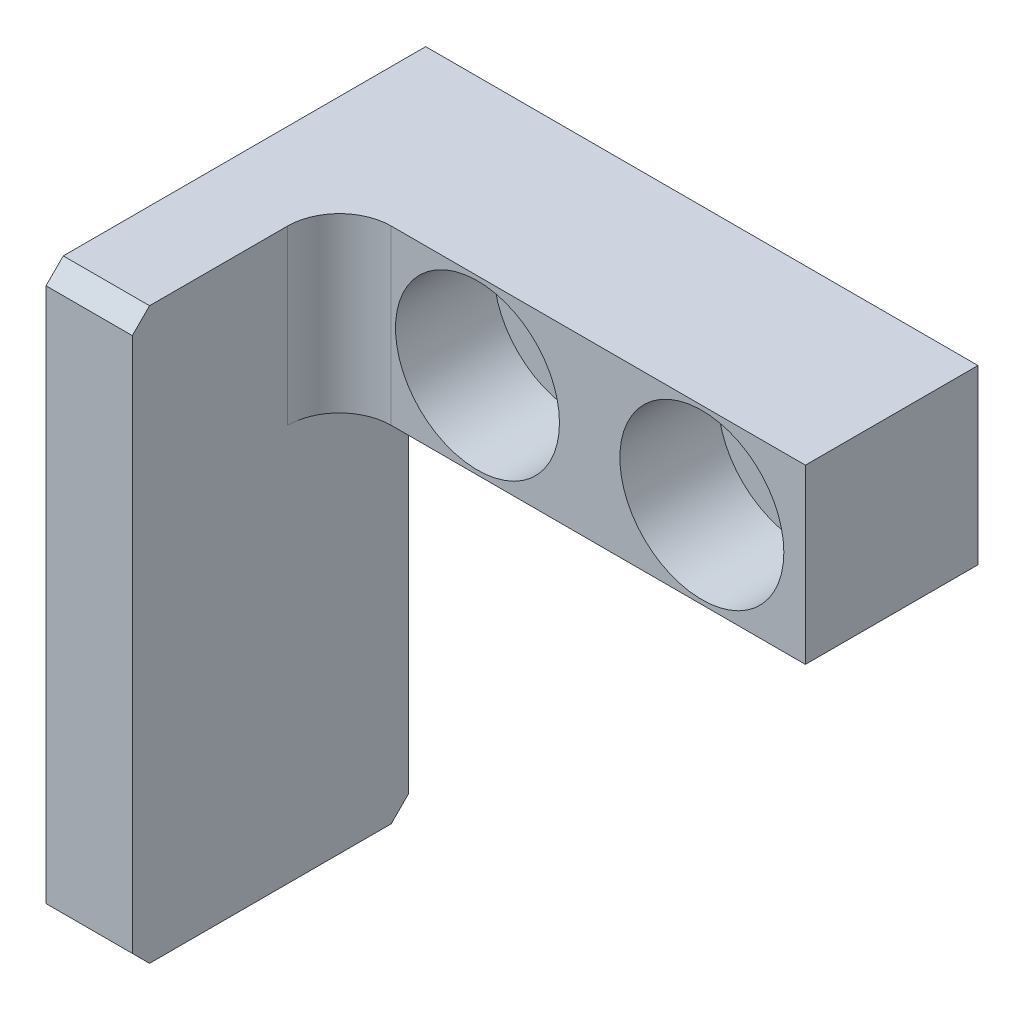
ISO-10303-21;
HEADER;
FILE_DESCRIPTION(('STEP AP214'),'2;1');
FILE_NAME('part.step','',(''),(''),'','','');
FILE_SCHEMA(('AUTOMOTIVE_DESIGN { 1 0 10303 214 1 1 1 1 }'));
ENDSEC;
DATA;
#1=APPLICATION_CONTEXT('core data for automotive mechanical design processes');
#2=APPLICATION_PROTOCOL_DEFINITION('international standard','automotive_design',2000,#1);
#3=PRODUCT_CONTEXT('',#1,'mechanical');
#4=PRODUCT('Part','Part','',(#3));
#5=PRODUCT_RELATED_PRODUCT_CATEGORY('part','',(#4));
#6=PRODUCT_DEFINITION_FORMATION('','',#4);
#7=PRODUCT_DEFINITION_CONTEXT('part definition',#1,'design');
#8=PRODUCT_DEFINITION('design','',#6,#7);
#9=PRODUCT_DEFINITION_SHAPE('','',#8);
#10=(LENGTH_UNIT() NAMED_UNIT(*) SI_UNIT(.MILLI.,.METRE.));
#11=(NAMED_UNIT(*) PLANE_ANGLE_UNIT() SI_UNIT($,.RADIAN.));
#12=(NAMED_UNIT(*) SI_UNIT($,.STERADIAN.) SOLID_ANGLE_UNIT());
#13=UNCERTAINTY_MEASURE_WITH_UNIT(LENGTH_MEASURE(1.E-05),#10,'distance_accuracy_value','');
#14=(GEOMETRIC_REPRESENTATION_CONTEXT(3) GLOBAL_UNCERTAINTY_ASSIGNED_CONTEXT((#13)) GLOBAL_UNIT_ASSIGNED_CONTEXT((#10,
#11,#12)) REPRESENTATION_CONTEXT('',''));
#15=CARTESIAN_POINT('',(0.,0.,0.));
#16=DIRECTION('',(0.,0.,1.));
#17=DIRECTION('',(1.,0.,0.));
#18=AXIS2_PLACEMENT_3D('',#15,#16,#17);
#19=CARTESIAN_POINT('',(16.,33.,11.));
#20=DIRECTION('',(-1.,0.,0.));
#21=DIRECTION('',(0.,0.,1.));
#22=AXIS2_PLACEMENT_3D('',#19,#20,#21);
#23=PLANE('',#22);
#24=DIRECTION('',(0.,0.,-1.));
#25=VECTOR('',#24,1.);
#26=CARTESIAN_POINT('',(16.,23.,-1.));
#27=LINE('',#26,#25);
#28=CARTESIAN_POINT('',(16.,23.,-1.));
#29=VERTEX_POINT('',#28);
#30=CARTESIAN_POINT('',(16.,23.,-11.));
#31=VERTEX_POINT('',#30);
#32=EDGE_CURVE('E137',#29,#31,#27,.T.);
#33=ORIENTED_EDGE('',*,*,#32,.T.);
#34=DIRECTION('',(0.,-1.,0.));
#35=VECTOR('',#34,1.);
#36=CARTESIAN_POINT('',(16.,33.,-11.));
#37=LINE('',#36,#35);
#38=CARTESIAN_POINT('',(16.,33.,-11.));
#39=VERTEX_POINT('',#38);
#40=EDGE_CURVE('E132',#39,#31,#37,.T.);
#41=ORIENTED_EDGE('',*,*,#40,.F.);
#42=DIRECTION('',(0.,0.,-1.));
#43=VECTOR('',#42,1.);
#44=CARTESIAN_POINT('',(16.,33.,11.));
#45=LINE('',#44,#43);
#46=CARTESIAN_POINT('',(16.,33.,-1.));
#47=VERTEX_POINT('',#46);
#48=EDGE_CURVE('E202',#47,#39,#45,.T.);
#49=ORIENTED_EDGE('',*,*,#48,.F.);
#50=DIRECTION('',(0.,1.,0.));
#51=VECTOR('',#50,1.);
#52=CARTESIAN_POINT('',(16.,0.,-1.));
#53=LINE('',#52,#51);
#54=EDGE_CURVE('E200',#29,#47,#53,.T.);
#55=ORIENTED_EDGE('',*,*,#54,.F.);
#56=EDGE_LOOP('',(#33,#41,#49,#55));
#57=FACE_BOUND('',#56,.T.);
#58=ADVANCED_FACE('F34',(#57),#23,.F.);
#59=CARTESIAN_POINT('',(-16.,33.,-11.));
#60=DIRECTION('',(0.,0.,1.));
#61=DIRECTION('',(1.,0.,0.));
#62=AXIS2_PLACEMENT_3D('',#59,#60,#61);
#63=PLANE('',#62);
#64=CARTESIAN_POINT('',(-3.,28.,-11.));
#65=DIRECTION('',(0.,0.,1.));
#66=DIRECTION('',(1.,0.,0.));
#67=AXIS2_PLACEMENT_3D('',#64,#65,#66);
#68=CIRCLE('',#67,2.75);
#69=CARTESIAN_POINT('',(-0.249999999999997,28.,-11.));
#70=VERTEX_POINT('',#69);
#71=EDGE_CURVE('E276',#70,#70,#68,.T.);
#72=ORIENTED_EDGE('',*,*,#71,.T.);
#73=EDGE_LOOP('',(#72));
#74=FACE_BOUND('',#73,.T.);
#75=CARTESIAN_POINT('',(10.,28.,-11.));
#76=DIRECTION('',(0.,0.,1.));
#77=DIRECTION('',(1.,0.,0.));
#78=AXIS2_PLACEMENT_3D('',#75,#76,#77);
#79=CIRCLE('',#78,2.75);
#80=CARTESIAN_POINT('',(12.75,28.,-11.));
#81=VERTEX_POINT('',#80);
#82=EDGE_CURVE('E261',#81,#81,#79,.T.);
#83=ORIENTED_EDGE('',*,*,#82,.T.);
#84=EDGE_LOOP('',(#83));
#85=FACE_BOUND('',#84,.T.);
#86=DIRECTION('',(1.,0.,0.));
#87=VECTOR('',#86,1.);
#88=CARTESIAN_POINT('',(-36.0798724079689,23.,-11.));
#89=LINE('',#88,#87);
#90=CARTESIAN_POINT('',(-16.,23.,-11.));
#91=VERTEX_POINT('',#90);
#92=EDGE_CURVE('E125',#91,#31,#89,.T.);
#93=ORIENTED_EDGE('',*,*,#92,.F.);
#94=DIRECTION('',(0.,-1.,0.));
#95=VECTOR('',#94,1.);
#96=CARTESIAN_POINT('',(-16.,33.,-11.));
#97=LINE('',#96,#95);
#98=CARTESIAN_POINT('',(-16.,33.,-11.));
#99=VERTEX_POINT('',#98);
#100=EDGE_CURVE('E130',#99,#91,#97,.T.);
#101=ORIENTED_EDGE('',*,*,#100,.F.);
#102=DIRECTION('',(-1.,0.,0.));
#103=VECTOR('',#102,1.);
#104=CARTESIAN_POINT('',(-16.,33.,-11.));
#105=LINE('',#104,#103);
#106=EDGE_CURVE('E210',#39,#99,#105,.T.);
#107=ORIENTED_EDGE('',*,*,#106,.F.);
#108=ORIENTED_EDGE('',*,*,#40,.T.);
#109=EDGE_LOOP('',(#93,#101,#107,#108));
#110=FACE_BOUND('',#109,.T.);
#111=ADVANCED_FACE('F127',(#74,#85,#110),#63,.F.);
#112=CARTESIAN_POINT('',(16.,0.,-1.));
#113=DIRECTION('',(0.,0.,-1.));
#114=DIRECTION('',(-1.,0.,0.));
#115=AXIS2_PLACEMENT_3D('',#112,#113,#114);
#116=PLANE('',#115);
#117=CARTESIAN_POINT('',(-3.,28.,-0.999999999999999));
#118=DIRECTION('',(0.,0.,1.));
#119=DIRECTION('',(1.,0.,0.));
#120=AXIS2_PLACEMENT_3D('',#117,#118,#119);
#121=CIRCLE('',#120,4.75);
#122=CARTESIAN_POINT('',(1.75,28.,-0.999999999999999));
#123=VERTEX_POINT('',#122);
#124=EDGE_CURVE('E285',#123,#123,#121,.T.);
#125=ORIENTED_EDGE('',*,*,#124,.F.);
#126=EDGE_LOOP('',(#125));
#127=FACE_BOUND('',#126,.T.);
#128=CARTESIAN_POINT('',(10.,28.,-0.999999999999999));
#129=DIRECTION('',(0.,0.,1.));
#130=DIRECTION('',(1.,0.,0.));
#131=AXIS2_PLACEMENT_3D('',#128,#129,#130);
#132=CIRCLE('',#131,4.75);
#133=CARTESIAN_POINT('',(14.75,28.,-0.999999999999999));
#134=VERTEX_POINT('',#133);
#135=EDGE_CURVE('E273',#134,#134,#132,.T.);
#136=ORIENTED_EDGE('',*,*,#135,.F.);
#137=EDGE_LOOP('',(#136));
#138=FACE_BOUND('',#137,.T.);
#139=DIRECTION('',(-1.,0.,0.));
#140=VECTOR('',#139,1.);
#141=CARTESIAN_POINT('',(16.,33.,-1.));
#142=LINE('',#141,#140);
#143=CARTESIAN_POINT('',(-8.,33.,-0.999999999999998));
#144=VERTEX_POINT('',#143);
#145=EDGE_CURVE('E251',#47,#144,#142,.T.);
#146=ORIENTED_EDGE('',*,*,#145,.T.);
#147=DIRECTION('',(0.,1.,0.));
#148=VECTOR('',#147,1.);
#149=CARTESIAN_POINT('',(-8.,23.,-0.999999999999998));
#150=LINE('',#149,#148);
#151=CARTESIAN_POINT('',(-8.,23.,-1.));
#152=VERTEX_POINT('',#151);
#153=EDGE_CURVE('E160',#144,#152,#150,.F.);
#154=ORIENTED_EDGE('',*,*,#153,.T.);
#155=DIRECTION('',(1.,0.,0.));
#156=VECTOR('',#155,1.);
#157=CARTESIAN_POINT('',(-36.0798724079689,23.,-1.));
#158=LINE('',#157,#156);
#159=EDGE_CURVE('E260',#152,#29,#158,.T.);
#160=ORIENTED_EDGE('',*,*,#159,.T.);
#161=ORIENTED_EDGE('',*,*,#54,.T.);
#162=EDGE_LOOP('',(#146,#154,#160,#161));
#163=FACE_BOUND('',#162,.T.);
#164=ADVANCED_FACE('F229',(#127,#138,#163),#116,.F.);
#165=CARTESIAN_POINT('',(-16.,33.,11.));
#166=DIRECTION('',(1.,0.,0.));
#167=DIRECTION('',(0.,0.,-1.));
#168=AXIS2_PLACEMENT_3D('',#165,#166,#167);
#169=PLANE('',#168);
#170=DIRECTION('',(0.,-1.,0.));
#171=VECTOR('',#170,1.);
#172=CARTESIAN_POINT('',(-16.,0.,-5.));
#173=LINE('',#172,#171);
#174=CARTESIAN_POINT('',(-16.,23.,-5.));
#175=VERTEX_POINT('',#174);
#176=CARTESIAN_POINT('',(-16.,1.,-5.));
#177=VERTEX_POINT('',#176);
#178=EDGE_CURVE('E146',#175,#177,#173,.T.);
#179=ORIENTED_EDGE('',*,*,#178,.T.);
#180=DIRECTION('',(0.,-0.70710678118655,0.707106781186545));
#181=VECTOR('',#180,1.);
#182=CARTESIAN_POINT('',(-16.,0.,-4.00000000000001));
#183=LINE('',#182,#181);
#184=CARTESIAN_POINT('',(-16.,0.,-4.));
#185=VERTEX_POINT('',#184);
#186=EDGE_CURVE('E182',#177,#185,#183,.T.);
#187=ORIENTED_EDGE('',*,*,#186,.T.);
#188=DIRECTION('',(0.,0.,1.));
#189=VECTOR('',#188,1.);
#190=CARTESIAN_POINT('',(-16.,0.,11.));
#191=LINE('',#190,#189);
#192=CARTESIAN_POINT('',(-16.,0.,9.99999999999999));
#193=VERTEX_POINT('',#192);
#194=EDGE_CURVE('E199',#185,#193,#191,.T.);
#195=ORIENTED_EDGE('',*,*,#194,.T.);
#196=DIRECTION('',(0.,0.707106781186545,0.70710678118655));
#197=VECTOR('',#196,1.);
#198=CARTESIAN_POINT('',(-16.,1.,11.));
#199=LINE('',#198,#197);
#200=CARTESIAN_POINT('',(-16.,1.00000000000001,11.));
#201=VERTEX_POINT('',#200);
#202=EDGE_CURVE('E55',#193,#201,#199,.T.);
#203=ORIENTED_EDGE('',*,*,#202,.T.);
#204=DIRECTION('',(0.,-1.,0.));
#205=VECTOR('',#204,1.);
#206=CARTESIAN_POINT('',(-16.,33.,11.));
#207=LINE('',#206,#205);
#208=CARTESIAN_POINT('',(-16.,32.,11.));
#209=VERTEX_POINT('',#208);
#210=EDGE_CURVE('E151',#209,#201,#207,.T.);
#211=ORIENTED_EDGE('',*,*,#210,.F.);
#212=DIRECTION('',(0.,-0.70710678118655,0.707106781186545));
#213=VECTOR('',#212,1.);
#214=CARTESIAN_POINT('',(-16.,33.,10.));
#215=LINE('',#214,#213);
#216=CARTESIAN_POINT('',(-16.,33.,10.));
#217=VERTEX_POINT('',#216);
#218=EDGE_CURVE('E49',#209,#217,#215,.F.);
#219=ORIENTED_EDGE('',*,*,#218,.T.);
#220=DIRECTION('',(0.,0.,1.));
#221=VECTOR('',#220,1.);
#222=CARTESIAN_POINT('',(-16.,33.,11.));
#223=LINE('',#222,#221);
#224=EDGE_CURVE('E150',#99,#217,#223,.T.);
#225=ORIENTED_EDGE('',*,*,#224,.F.);
#226=ORIENTED_EDGE('',*,*,#100,.T.);
#227=DIRECTION('',(0.,0.,1.));
#228=VECTOR('',#227,1.);
#229=CARTESIAN_POINT('',(-16.,23.,-11.));
#230=LINE('',#229,#228);
#231=EDGE_CURVE('E140',#91,#175,#230,.T.);
#232=ORIENTED_EDGE('',*,*,#231,.T.);
#233=EDGE_LOOP('',(#179,#187,#195,#203,#211,#219,#225,#226,#232));
#234=FACE_BOUND('',#233,.T.);
#235=ADVANCED_FACE('F149',(#234),#169,.F.);
#236=CARTESIAN_POINT('',(-16.,33.,11.));
#237=DIRECTION('',(0.,0.,-1.));
#238=DIRECTION('',(-1.,0.,0.));
#239=AXIS2_PLACEMENT_3D('',#236,#237,#238);
#240=PLANE('',#239);
#241=ORIENTED_EDGE('',*,*,#210,.T.);
#242=DIRECTION('',(1.,0.,0.));
#243=VECTOR('',#242,1.);
#244=CARTESIAN_POINT('',(-11.,1.,11.));
#245=LINE('',#244,#243);
#246=CARTESIAN_POINT('',(-11.,1.,11.));
#247=VERTEX_POINT('',#246);
#248=EDGE_CURVE('E42',#201,#247,#245,.T.);
#249=ORIENTED_EDGE('',*,*,#248,.T.);
#250=DIRECTION('',(0.,1.,0.));
#251=VECTOR('',#250,1.);
#252=CARTESIAN_POINT('',(-11.,0.,11.));
#253=LINE('',#252,#251);
#254=CARTESIAN_POINT('',(-11.,32.,11.));
#255=VERTEX_POINT('',#254);
#256=EDGE_CURVE('E191',#247,#255,#253,.T.);
#257=ORIENTED_EDGE('',*,*,#256,.T.);
#258=DIRECTION('',(-1.,0.,0.));
#259=VECTOR('',#258,1.);
#260=CARTESIAN_POINT('',(-16.,32.,11.));
#261=LINE('',#260,#259);
#262=EDGE_CURVE('E184',#255,#209,#261,.T.);
#263=ORIENTED_EDGE('',*,*,#262,.T.);
#264=EDGE_LOOP('',(#241,#249,#257,#263));
#265=FACE_BOUND('',#264,.T.);
#266=ADVANCED_FACE('F190',(#265),#240,.F.);
#267=CARTESIAN_POINT('',(0.,33.,0.));
#268=DIRECTION('',(0.,-1.,0.));
#269=DIRECTION('',(0.,0.,-1.));
#270=AXIS2_PLACEMENT_3D('',#267,#268,#269);
#271=PLANE('',#270);
#272=ORIENTED_EDGE('',*,*,#224,.T.);
#273=DIRECTION('',(1.,0.,0.));
#274=VECTOR('',#273,1.);
#275=CARTESIAN_POINT('',(0.,33.,10.));
#276=LINE('',#275,#274);
#277=CARTESIAN_POINT('',(-11.,33.,10.));
#278=VERTEX_POINT('',#277);
#279=EDGE_CURVE('E11',#217,#278,#276,.T.);
#280=ORIENTED_EDGE('',*,*,#279,.T.);
#281=DIRECTION('',(0.,0.,1.));
#282=VECTOR('',#281,1.);
#283=CARTESIAN_POINT('',(-11.,33.,11.));
#284=LINE('',#283,#282);
#285=CARTESIAN_POINT('',(-11.,33.,2.));
#286=VERTEX_POINT('',#285);
#287=EDGE_CURVE('E206',#286,#278,#284,.T.);
#288=ORIENTED_EDGE('',*,*,#287,.F.);
#289=CARTESIAN_POINT('',(-8.,33.,2.));
#290=DIRECTION('',(0.,-1.,0.));
#291=DIRECTION('',(0.,0.,-1.));
#292=AXIS2_PLACEMENT_3D('',#289,#290,#291);
#293=CIRCLE('',#292,3.);
#294=EDGE_CURVE('E162',#286,#144,#293,.T.);
#295=ORIENTED_EDGE('',*,*,#294,.T.);
#296=ORIENTED_EDGE('',*,*,#145,.F.);
#297=ORIENTED_EDGE('',*,*,#48,.T.);
#298=ORIENTED_EDGE('',*,*,#106,.T.);
#299=EDGE_LOOP('',(#272,#280,#288,#295,#296,#297,#298));
#300=FACE_BOUND('',#299,.T.);
#301=ADVANCED_FACE('F214',(#300),#271,.F.);
#302=CARTESIAN_POINT('',(0.,0.,0.));
#303=DIRECTION('',(0.,-1.,0.));
#304=DIRECTION('',(0.,0.,-1.));
#305=AXIS2_PLACEMENT_3D('',#302,#303,#304);
#306=PLANE('',#305);
#307=ORIENTED_EDGE('',*,*,#194,.F.);
#308=DIRECTION('',(1.,0.,0.));
#309=VECTOR('',#308,1.);
#310=CARTESIAN_POINT('',(-11.,0.,-4.00000000000001));
#311=LINE('',#310,#309);
#312=CARTESIAN_POINT('',(-11.,0.,-4.));
#313=VERTEX_POINT('',#312);
#314=EDGE_CURVE('E169',#185,#313,#311,.T.);
#315=ORIENTED_EDGE('',*,*,#314,.T.);
#316=DIRECTION('',(0.,0.,1.));
#317=VECTOR('',#316,1.);
#318=CARTESIAN_POINT('',(-11.,0.,11.));
#319=LINE('',#318,#317);
#320=CARTESIAN_POINT('',(-11.,0.,9.99999999999999));
#321=VERTEX_POINT('',#320);
#322=EDGE_CURVE('E203',#313,#321,#319,.T.);
#323=ORIENTED_EDGE('',*,*,#322,.T.);
#324=DIRECTION('',(-1.,0.,0.));
#325=VECTOR('',#324,1.);
#326=CARTESIAN_POINT('',(-16.,0.,9.99999999999999));
#327=LINE('',#326,#325);
#328=EDGE_CURVE('E167',#321,#193,#327,.T.);
#329=ORIENTED_EDGE('',*,*,#328,.T.);
#330=EDGE_LOOP('',(#307,#315,#323,#329));
#331=FACE_BOUND('',#330,.T.);
#332=ADVANCED_FACE('F248',(#331),#306,.T.);
#333=CARTESIAN_POINT('',(-11.,0.,11.));
#334=DIRECTION('',(-1.,0.,0.));
#335=DIRECTION('',(0.,0.,1.));
#336=AXIS2_PLACEMENT_3D('',#333,#334,#335);
#337=PLANE('',#336);
#338=ORIENTED_EDGE('',*,*,#322,.F.);
#339=DIRECTION('',(0.,0.70710678118655,-0.707106781186545));
#340=VECTOR('',#339,1.);
#341=CARTESIAN_POINT('',(-11.,0.,-4.00000000000001));
#342=LINE('',#341,#340);
#343=CARTESIAN_POINT('',(-11.,1.,-5.));
#344=VERTEX_POINT('',#343);
#345=EDGE_CURVE('E176',#313,#344,#342,.T.);
#346=ORIENTED_EDGE('',*,*,#345,.T.);
#347=DIRECTION('',(0.,-1.,0.));
#348=VECTOR('',#347,1.);
#349=CARTESIAN_POINT('',(-11.,0.,-5.));
#350=LINE('',#349,#348);
#351=CARTESIAN_POINT('',(-11.,23.,-5.));
#352=VERTEX_POINT('',#351);
#353=EDGE_CURVE('E147',#352,#344,#350,.T.);
#354=ORIENTED_EDGE('',*,*,#353,.F.);
#355=DIRECTION('',(0.,0.,-1.));
#356=VECTOR('',#355,1.);
#357=CARTESIAN_POINT('',(-11.,23.,-1.));
#358=LINE('',#357,#356);
#359=CARTESIAN_POINT('',(-11.,23.,2.));
#360=VERTEX_POINT('',#359);
#361=EDGE_CURVE('E136',#360,#352,#358,.T.);
#362=ORIENTED_EDGE('',*,*,#361,.F.);
#363=DIRECTION('',(0.,1.,0.));
#364=VECTOR('',#363,1.);
#365=CARTESIAN_POINT('',(-11.,33.,2.));
#366=LINE('',#365,#364);
#367=EDGE_CURVE('E153',#360,#286,#366,.T.);
#368=ORIENTED_EDGE('',*,*,#367,.T.);
#369=ORIENTED_EDGE('',*,*,#287,.T.);
#370=DIRECTION('',(0.,0.70710678118655,-0.707106781186545));
#371=VECTOR('',#370,1.);
#372=CARTESIAN_POINT('',(-11.,33.,10.));
#373=LINE('',#372,#371);
#374=EDGE_CURVE('E172',#278,#255,#373,.F.);
#375=ORIENTED_EDGE('',*,*,#374,.T.);
#376=ORIENTED_EDGE('',*,*,#256,.F.);
#377=DIRECTION('',(0.,-0.707106781186545,-0.70710678118655));
#378=VECTOR('',#377,1.);
#379=CARTESIAN_POINT('',(-11.,1.,11.));
#380=LINE('',#379,#378);
#381=EDGE_CURVE('E174',#247,#321,#380,.T.);
#382=ORIENTED_EDGE('',*,*,#381,.T.);
#383=EDGE_LOOP('',(#338,#346,#354,#362,#368,#369,#375,#376,#382));
#384=FACE_BOUND('',#383,.T.);
#385=ADVANCED_FACE('F196',(#384),#337,.F.);
#386=CARTESIAN_POINT('',(-36.0798724079689,23.,-1.));
#387=DIRECTION('',(0.,-1.,0.));
#388=DIRECTION('',(0.,0.,-1.));
#389=AXIS2_PLACEMENT_3D('',#386,#387,#388);
#390=PLANE('',#389);
#391=ORIENTED_EDGE('',*,*,#361,.T.);
#392=DIRECTION('',(1.,0.,0.));
#393=VECTOR('',#392,1.);
#394=CARTESIAN_POINT('',(-16.,23.,-5.));
#395=LINE('',#394,#393);
#396=EDGE_CURVE('E143',#175,#352,#395,.T.);
#397=ORIENTED_EDGE('',*,*,#396,.F.);
#398=ORIENTED_EDGE('',*,*,#231,.F.);
#399=ORIENTED_EDGE('',*,*,#92,.T.);
#400=ORIENTED_EDGE('',*,*,#32,.F.);
#401=ORIENTED_EDGE('',*,*,#159,.F.);
#402=CARTESIAN_POINT('',(-8.,23.,2.));
#403=DIRECTION('',(0.,-1.,0.));
#404=DIRECTION('',(0.,0.,-1.));
#405=AXIS2_PLACEMENT_3D('',#402,#403,#404);
#406=CIRCLE('',#405,3.);
#407=EDGE_CURVE('E164',#152,#360,#406,.F.);
#408=ORIENTED_EDGE('',*,*,#407,.T.);
#409=EDGE_LOOP('',(#391,#397,#398,#399,#400,#401,#408));
#410=FACE_BOUND('',#409,.T.);
#411=ADVANCED_FACE('F142',(#410),#390,.T.);
#412=CARTESIAN_POINT('',(10.,28.,-0.999999999999999));
#413=DIRECTION('',(0.,0.,1.));
#414=DIRECTION('',(1.,0.,0.));
#415=AXIS2_PLACEMENT_3D('',#412,#413,#414);
#416=CYLINDRICAL_SURFACE('',#415,2.75);
#417=ORIENTED_EDGE('',*,*,#82,.F.);
#418=EDGE_LOOP('',(#417));
#419=FACE_BOUND('',#418,.T.);
#420=CARTESIAN_POINT('',(10.,28.,-6.7));
#421=DIRECTION('',(0.,0.,1.));
#422=DIRECTION('',(1.,0.,0.));
#423=AXIS2_PLACEMENT_3D('',#420,#421,#422);
#424=CIRCLE('',#423,2.75);
#425=CARTESIAN_POINT('',(12.75,28.,-6.7));
#426=VERTEX_POINT('',#425);
#427=EDGE_CURVE('E264',#426,#426,#424,.T.);
#428=ORIENTED_EDGE('',*,*,#427,.T.);
#429=EDGE_LOOP('',(#428));
#430=FACE_BOUND('',#429,.T.);
#431=ADVANCED_FACE('F337',(#419,#430),#416,.F.);
#432=CARTESIAN_POINT('',(12.75,28.,-6.7));
#433=DIRECTION('',(0.,0.,-1.));
#434=DIRECTION('',(-1.,0.,0.));
#435=AXIS2_PLACEMENT_3D('',#432,#433,#434);
#436=PLANE('',#435);
#437=ORIENTED_EDGE('',*,*,#427,.F.);
#438=EDGE_LOOP('',(#437));
#439=FACE_BOUND('',#438,.T.);
#440=CARTESIAN_POINT('',(10.,28.,-6.7));
#441=DIRECTION('',(0.,0.,1.));
#442=DIRECTION('',(1.,0.,0.));
#443=AXIS2_PLACEMENT_3D('',#440,#441,#442);
#444=CIRCLE('',#443,4.75);
#445=CARTESIAN_POINT('',(14.75,28.,-6.7));
#446=VERTEX_POINT('',#445);
#447=EDGE_CURVE('E268',#446,#446,#444,.T.);
#448=ORIENTED_EDGE('',*,*,#447,.T.);
#449=EDGE_LOOP('',(#448));
#450=FACE_BOUND('',#449,.T.);
#451=ADVANCED_FACE('F344',(#439,#450),#436,.F.);
#452=CARTESIAN_POINT('',(10.,28.,-0.999999999999999));
#453=DIRECTION('',(0.,0.,1.));
#454=DIRECTION('',(1.,0.,0.));
#455=AXIS2_PLACEMENT_3D('',#452,#453,#454);
#456=CYLINDRICAL_SURFACE('',#455,4.75);
#457=ORIENTED_EDGE('',*,*,#447,.F.);
#458=EDGE_LOOP('',(#457));
#459=FACE_BOUND('',#458,.T.);
#460=ORIENTED_EDGE('',*,*,#135,.T.);
#461=EDGE_LOOP('',(#460));
#462=FACE_BOUND('',#461,.T.);
#463=ADVANCED_FACE('F352',(#459,#462),#456,.F.);
#464=CARTESIAN_POINT('',(-3.,28.,-0.999999999999999));
#465=DIRECTION('',(0.,0.,1.));
#466=DIRECTION('',(1.,0.,0.));
#467=AXIS2_PLACEMENT_3D('',#464,#465,#466);
#468=CYLINDRICAL_SURFACE('',#467,2.75);
#469=ORIENTED_EDGE('',*,*,#71,.F.);
#470=EDGE_LOOP('',(#469));
#471=FACE_BOUND('',#470,.T.);
#472=CARTESIAN_POINT('',(-3.,28.,-6.7));
#473=DIRECTION('',(0.,0.,1.));
#474=DIRECTION('',(1.,0.,0.));
#475=AXIS2_PLACEMENT_3D('',#472,#473,#474);
#476=CIRCLE('',#475,2.75);
#477=CARTESIAN_POINT('',(-0.249999999999997,28.,-6.7));
#478=VERTEX_POINT('',#477);
#479=EDGE_CURVE('E279',#478,#478,#476,.T.);
#480=ORIENTED_EDGE('',*,*,#479,.T.);
#481=EDGE_LOOP('',(#480));
#482=FACE_BOUND('',#481,.T.);
#483=ADVANCED_FACE('F360',(#471,#482),#468,.F.);
#484=CARTESIAN_POINT('',(-0.249999999999997,28.,-6.7));
#485=DIRECTION('',(0.,0.,-1.));
#486=DIRECTION('',(-1.,0.,0.));
#487=AXIS2_PLACEMENT_3D('',#484,#485,#486);
#488=PLANE('',#487);
#489=ORIENTED_EDGE('',*,*,#479,.F.);
#490=EDGE_LOOP('',(#489));
#491=FACE_BOUND('',#490,.T.);
#492=CARTESIAN_POINT('',(-3.,28.,-6.7));
#493=DIRECTION('',(0.,0.,1.));
#494=DIRECTION('',(1.,0.,0.));
#495=AXIS2_PLACEMENT_3D('',#492,#493,#494);
#496=CIRCLE('',#495,4.75);
#497=CARTESIAN_POINT('',(1.75,28.,-6.7));
#498=VERTEX_POINT('',#497);
#499=EDGE_CURVE('E282',#498,#498,#496,.T.);
#500=ORIENTED_EDGE('',*,*,#499,.T.);
#501=EDGE_LOOP('',(#500));
#502=FACE_BOUND('',#501,.T.);
#503=ADVANCED_FACE('F368',(#491,#502),#488,.F.);
#504=CARTESIAN_POINT('',(-3.,28.,-0.999999999999999));
#505=DIRECTION('',(0.,0.,1.));
#506=DIRECTION('',(1.,0.,0.));
#507=AXIS2_PLACEMENT_3D('',#504,#505,#506);
#508=CYLINDRICAL_SURFACE('',#507,4.75);
#509=ORIENTED_EDGE('',*,*,#499,.F.);
#510=EDGE_LOOP('',(#509));
#511=FACE_BOUND('',#510,.T.);
#512=ORIENTED_EDGE('',*,*,#124,.T.);
#513=EDGE_LOOP('',(#512));
#514=FACE_BOUND('',#513,.T.);
#515=ADVANCED_FACE('F376',(#511,#514),#508,.F.);
#516=CARTESIAN_POINT('',(-16.,0.,-5.));
#517=DIRECTION('',(0.,0.,1.));
#518=DIRECTION('',(0.,-1.,0.));
#519=AXIS2_PLACEMENT_3D('',#516,#517,#518);
#520=PLANE('',#519);
#521=ORIENTED_EDGE('',*,*,#353,.T.);
#522=DIRECTION('',(-1.,0.,0.));
#523=VECTOR('',#522,1.);
#524=CARTESIAN_POINT('',(-16.,1.,-5.));
#525=LINE('',#524,#523);
#526=EDGE_CURVE('E178',#344,#177,#525,.T.);
#527=ORIENTED_EDGE('',*,*,#526,.T.);
#528=ORIENTED_EDGE('',*,*,#178,.F.);
#529=ORIENTED_EDGE('',*,*,#396,.T.);
#530=EDGE_LOOP('',(#521,#527,#528,#529));
#531=FACE_BOUND('',#530,.T.);
#532=ADVANCED_FACE('F237',(#531),#520,.F.);
#533=CARTESIAN_POINT('',(-8.,0.,2.));
#534=DIRECTION('',(0.,-1.,0.));
#535=DIRECTION('',(0.,0.,-1.));
#536=AXIS2_PLACEMENT_3D('',#533,#534,#535);
#537=CYLINDRICAL_SURFACE('',#536,3.);
#538=ORIENTED_EDGE('',*,*,#407,.F.);
#539=ORIENTED_EDGE('',*,*,#153,.F.);
#540=ORIENTED_EDGE('',*,*,#294,.F.);
#541=ORIENTED_EDGE('',*,*,#367,.F.);
#542=EDGE_LOOP('',(#538,#539,#540,#541));
#543=FACE_BOUND('',#542,.T.);
#544=ADVANCED_FACE('F234',(#543),#537,.F.);
#545=CARTESIAN_POINT('',(0.,0.,-4.00000000000001));
#546=DIRECTION('',(0.,-0.707106781186545,-0.70710678118655));
#547=DIRECTION('',(-1.,0.,0.));
#548=AXIS2_PLACEMENT_3D('',#545,#546,#547);
#549=PLANE('',#548);
#550=ORIENTED_EDGE('',*,*,#186,.F.);
#551=ORIENTED_EDGE('',*,*,#526,.F.);
#552=ORIENTED_EDGE('',*,*,#345,.F.);
#553=ORIENTED_EDGE('',*,*,#314,.F.);
#554=EDGE_LOOP('',(#550,#551,#552,#553));
#555=FACE_BOUND('',#554,.T.);
#556=ADVANCED_FACE('F222',(#555),#549,.T.);
#557=CARTESIAN_POINT('',(-16.,1.,11.));
#558=DIRECTION('',(0.,-0.70710678118655,0.707106781186545));
#559=DIRECTION('',(-1.,0.,0.));
#560=AXIS2_PLACEMENT_3D('',#557,#558,#559);
#561=PLANE('',#560);
#562=ORIENTED_EDGE('',*,*,#202,.F.);
#563=ORIENTED_EDGE('',*,*,#328,.F.);
#564=ORIENTED_EDGE('',*,*,#381,.F.);
#565=ORIENTED_EDGE('',*,*,#248,.F.);
#566=EDGE_LOOP('',(#562,#563,#564,#565));
#567=FACE_BOUND('',#566,.T.);
#568=ADVANCED_FACE('F218',(#567),#561,.T.);
#569=CARTESIAN_POINT('',(0.,33.,10.));
#570=DIRECTION('',(0.,-0.707106781186545,-0.70710678118655));
#571=DIRECTION('',(1.,0.,0.));
#572=AXIS2_PLACEMENT_3D('',#569,#570,#571);
#573=PLANE('',#572);
#574=ORIENTED_EDGE('',*,*,#218,.F.);
#575=ORIENTED_EDGE('',*,*,#262,.F.);
#576=ORIENTED_EDGE('',*,*,#374,.F.);
#577=ORIENTED_EDGE('',*,*,#279,.F.);
#578=EDGE_LOOP('',(#574,#575,#576,#577));
#579=FACE_BOUND('',#578,.T.);
#580=ADVANCED_FACE('F36',(#579),#573,.F.);
#581=CLOSED_SHELL('',(#58,#111,#164,#235,#266,#301,#332,#385,#411,#431,#451,#463,#483,#503,#515,
#532,#544,#556,#568,#580));
#582=MANIFOLD_SOLID_BREP('B2',#581);
#583=ADVANCED_BREP_SHAPE_REPRESENTATION('',(#18,#582),#14);
#584=SHAPE_DEFINITION_REPRESENTATION(#9,#583);
ENDSEC;
END-ISO-10303-21;
